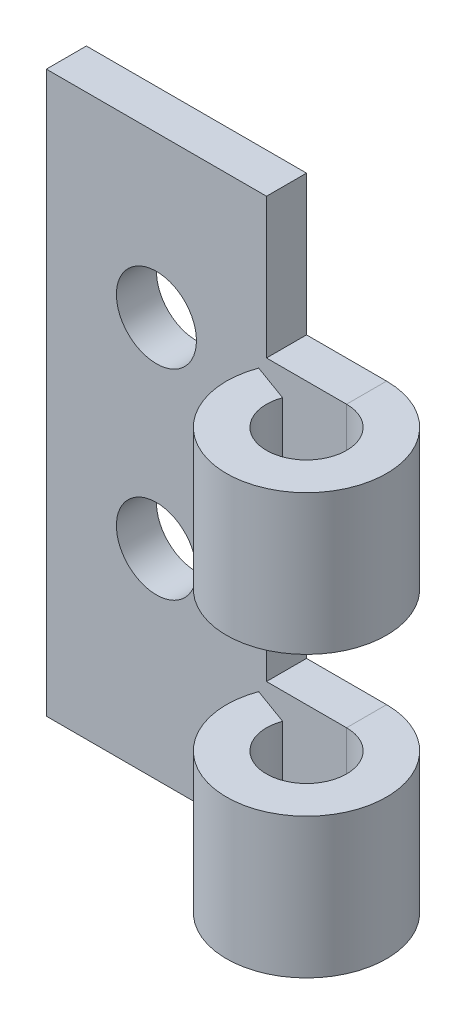
ISO-10303-21;
HEADER;
FILE_DESCRIPTION(('STEP AP214'),'2;1');
FILE_NAME('part.step','',(''),(''),'','','');
FILE_SCHEMA(('AUTOMOTIVE_DESIGN { 1 0 10303 214 1 1 1 1 }'));
ENDSEC;
DATA;
#1=APPLICATION_CONTEXT('core data for automotive mechanical design processes');
#2=APPLICATION_PROTOCOL_DEFINITION('international standard','automotive_design',2000,#1);
#3=PRODUCT_CONTEXT('',#1,'mechanical');
#4=PRODUCT('Part','Part','',(#3));
#5=PRODUCT_RELATED_PRODUCT_CATEGORY('part','',(#4));
#6=PRODUCT_DEFINITION_FORMATION('','',#4);
#7=PRODUCT_DEFINITION_CONTEXT('part definition',#1,'design');
#8=PRODUCT_DEFINITION('design','',#6,#7);
#9=PRODUCT_DEFINITION_SHAPE('','',#8);
#10=(LENGTH_UNIT() NAMED_UNIT(*) SI_UNIT(.MILLI.,.METRE.));
#11=(NAMED_UNIT(*) PLANE_ANGLE_UNIT() SI_UNIT($,.RADIAN.));
#12=(NAMED_UNIT(*) SI_UNIT($,.STERADIAN.) SOLID_ANGLE_UNIT());
#13=UNCERTAINTY_MEASURE_WITH_UNIT(LENGTH_MEASURE(1.E-05),#10,'distance_accuracy_value','');
#14=(GEOMETRIC_REPRESENTATION_CONTEXT(3) GLOBAL_UNCERTAINTY_ASSIGNED_CONTEXT((#13)) GLOBAL_UNIT_ASSIGNED_CONTEXT((#10,
#11,#12)) REPRESENTATION_CONTEXT('',''));
#15=CARTESIAN_POINT('',(0.,0.,0.));
#16=DIRECTION('',(0.,0.,1.));
#17=DIRECTION('',(1.,0.,0.));
#18=AXIS2_PLACEMENT_3D('',#15,#16,#17);
#19=CARTESIAN_POINT('',(-48.4821819299049,-11.4289291103172,1.));
#20=DIRECTION('',(1.,0.,0.));
#21=DIRECTION('',(0.,0.,-1.));
#22=AXIS2_PLACEMENT_3D('',#19,#20,#21);
#23=PLANE('',#22);
#24=DIRECTION('',(0.,-1.,0.));
#25=VECTOR('',#24,1.);
#26=CARTESIAN_POINT('',(-48.4821819299049,-11.4289291103172,0.));
#27=LINE('',#26,#25);
#28=CARTESIAN_POINT('',(-48.4821819299049,-11.4289291103172,0.));
#29=VERTEX_POINT('',#28);
#30=CARTESIAN_POINT('',(-48.4821819299049,-25.4289291103172,0.));
#31=VERTEX_POINT('',#30);
#32=EDGE_CURVE('E256',#29,#31,#27,.T.);
#33=ORIENTED_EDGE('',*,*,#32,.T.);
#34=DIRECTION('',(0.,0.,1.));
#35=VECTOR('',#34,1.);
#36=CARTESIAN_POINT('',(-48.4821819299049,-25.4289291103172,-0.00100000000000729));
#37=LINE('',#36,#35);
#38=CARTESIAN_POINT('',(-48.4821819299049,-25.4289291103172,1.));
#39=VERTEX_POINT('',#38);
#40=EDGE_CURVE('E190',#31,#39,#37,.T.);
#41=ORIENTED_EDGE('',*,*,#40,.T.);
#42=DIRECTION('',(0.,-1.,0.));
#43=VECTOR('',#42,1.);
#44=CARTESIAN_POINT('',(-48.4821819299049,-11.4289291103172,1.));
#45=LINE('',#44,#43);
#46=CARTESIAN_POINT('',(-48.4821819299049,-11.4289291103172,1.));
#47=VERTEX_POINT('',#46);
#48=EDGE_CURVE('E258',#47,#39,#45,.T.);
#49=ORIENTED_EDGE('',*,*,#48,.F.);
#50=DIRECTION('',(0.,0.,-1.));
#51=VECTOR('',#50,1.);
#52=CARTESIAN_POINT('',(-48.4821819299049,-11.4289291103172,1.));
#53=LINE('',#52,#51);
#54=EDGE_CURVE('E11',#47,#29,#53,.T.);
#55=ORIENTED_EDGE('',*,*,#54,.T.);
#56=EDGE_LOOP('',(#33,#41,#49,#55));
#57=FACE_BOUND('',#56,.T.);
#58=ADVANCED_FACE('F37',(#57),#23,.F.);
#59=CARTESIAN_POINT('',(-48.4821819299049,-11.4289291103172,1.));
#60=DIRECTION('',(0.,-1.,0.));
#61=DIRECTION('',(0.,0.,-1.));
#62=AXIS2_PLACEMENT_3D('',#59,#60,#61);
#63=PLANE('',#62);
#64=DIRECTION('',(-1.,0.,0.));
#65=VECTOR('',#64,1.);
#66=CARTESIAN_POINT('',(-48.4821819299049,-11.4289291103172,1.));
#67=LINE('',#66,#65);
#68=CARTESIAN_POINT('',(-42.9821819299048,-11.4289291103172,1.));
#69=VERTEX_POINT('',#68);
#70=EDGE_CURVE('E45',#69,#47,#67,.T.);
#71=ORIENTED_EDGE('',*,*,#70,.F.);
#72=DIRECTION('',(0.,0.,1.));
#73=VECTOR('',#72,1.);
#74=CARTESIAN_POINT('',(-42.9821819299048,-11.4289291103172,-0.00100000000000729));
#75=LINE('',#74,#73);
#76=CARTESIAN_POINT('',(-42.9821819299048,-11.4289291103172,0.));
#77=VERTEX_POINT('',#76);
#78=EDGE_CURVE('E142',#77,#69,#75,.T.);
#79=ORIENTED_EDGE('',*,*,#78,.F.);
#80=DIRECTION('',(-1.,0.,0.));
#81=VECTOR('',#80,1.);
#82=CARTESIAN_POINT('',(-48.4821819299049,-11.4289291103172,0.));
#83=LINE('',#82,#81);
#84=EDGE_CURVE('E158',#77,#29,#83,.T.);
#85=ORIENTED_EDGE('',*,*,#84,.T.);
#86=ORIENTED_EDGE('',*,*,#54,.F.);
#87=EDGE_LOOP('',(#71,#79,#85,#86));
#88=FACE_BOUND('',#87,.T.);
#89=ADVANCED_FACE('F263',(#88),#63,.F.);
#90=CARTESIAN_POINT('',(0.,0.,1.));
#91=DIRECTION('',(0.,0.,1.));
#92=DIRECTION('',(1.,0.,0.));
#93=AXIS2_PLACEMENT_3D('',#90,#91,#92);
#94=PLANE('',#93);
#95=CARTESIAN_POINT('',(-45.7321819299049,-15.4289291103172,1.));
#96=DIRECTION('',(0.,0.,1.));
#97=DIRECTION('',(1.,0.,0.));
#98=AXIS2_PLACEMENT_3D('',#95,#96,#97);
#99=CIRCLE('',#98,0.999999999999998);
#100=CARTESIAN_POINT('',(-44.7321819299048,-15.4289291103172,1.));
#101=VERTEX_POINT('',#100);
#102=EDGE_CURVE('E547',#101,#101,#99,.T.);
#103=ORIENTED_EDGE('',*,*,#102,.F.);
#104=EDGE_LOOP('',(#103));
#105=FACE_BOUND('',#104,.T.);
#106=CARTESIAN_POINT('',(-45.7321819299049,-20.4289291103172,1.));
#107=DIRECTION('',(0.,0.,1.));
#108=DIRECTION('',(1.,0.,0.));
#109=AXIS2_PLACEMENT_3D('',#106,#107,#108);
#110=CIRCLE('',#109,0.999999999999998);
#111=CARTESIAN_POINT('',(-44.7321819299048,-20.4289291103172,1.));
#112=VERTEX_POINT('',#111);
#113=EDGE_CURVE('E552',#112,#112,#110,.T.);
#114=ORIENTED_EDGE('',*,*,#113,.F.);
#115=EDGE_LOOP('',(#114));
#116=FACE_BOUND('',#115,.T.);
#117=DIRECTION('',(0.,-1.,0.));
#118=VECTOR('',#117,1.);
#119=CARTESIAN_POINT('',(-42.9821819299048,-14.9289291103172,1.));
#120=LINE('',#119,#118);
#121=CARTESIAN_POINT('',(-42.9821819299048,-14.9289291103172,1.));
#122=VERTEX_POINT('',#121);
#123=EDGE_CURVE('E139',#69,#122,#120,.T.);
#124=ORIENTED_EDGE('',*,*,#123,.F.);
#125=ORIENTED_EDGE('',*,*,#70,.T.);
#126=ORIENTED_EDGE('',*,*,#48,.T.);
#127=DIRECTION('',(-1.,0.,0.));
#128=VECTOR('',#127,1.);
#129=CARTESIAN_POINT('',(-40.9821819299049,-25.4289291103172,1.));
#130=LINE('',#129,#128);
#131=CARTESIAN_POINT('',(-40.9821819299049,-25.4289291103172,1.));
#132=VERTEX_POINT('',#131);
#133=EDGE_CURVE('E188',#132,#39,#130,.T.);
#134=ORIENTED_EDGE('',*,*,#133,.F.);
#135=DIRECTION('',(0.,1.,0.));
#136=VECTOR('',#135,1.);
#137=CARTESIAN_POINT('',(-40.9821819299049,-21.9289291103172,0.999999999999993));
#138=LINE('',#137,#136);
#139=CARTESIAN_POINT('',(-40.9821819299049,-21.9289291103172,0.999999999999993));
#140=VERTEX_POINT('',#139);
#141=EDGE_CURVE('E211',#140,#132,#138,.F.);
#142=ORIENTED_EDGE('',*,*,#141,.F.);
#143=DIRECTION('',(1.,0.,0.));
#144=VECTOR('',#143,1.);
#145=CARTESIAN_POINT('',(-42.9821819299049,-21.9289291103172,1.));
#146=LINE('',#145,#144);
#147=CARTESIAN_POINT('',(-42.9821819299049,-21.9289291103172,1.));
#148=VERTEX_POINT('',#147);
#149=EDGE_CURVE('E180',#148,#140,#146,.T.);
#150=ORIENTED_EDGE('',*,*,#149,.F.);
#151=DIRECTION('',(0.,-1.,0.));
#152=VECTOR('',#151,1.);
#153=CARTESIAN_POINT('',(-42.9821819299049,-21.9289291103172,1.));
#154=LINE('',#153,#152);
#155=CARTESIAN_POINT('',(-42.9821819299049,-18.4289291103172,1.));
#156=VERTEX_POINT('',#155);
#157=EDGE_CURVE('E177',#156,#148,#154,.T.);
#158=ORIENTED_EDGE('',*,*,#157,.F.);
#159=DIRECTION('',(-1.,0.,0.));
#160=VECTOR('',#159,1.);
#161=CARTESIAN_POINT('',(-42.9821819299049,-18.4289291103172,1.));
#162=LINE('',#161,#160);
#163=CARTESIAN_POINT('',(-40.9821819299049,-18.4289291103172,1.));
#164=VERTEX_POINT('',#163);
#165=EDGE_CURVE('E182',#164,#156,#162,.T.);
#166=ORIENTED_EDGE('',*,*,#165,.F.);
#167=DIRECTION('',(0.,1.,0.));
#168=VECTOR('',#167,1.);
#169=CARTESIAN_POINT('',(-40.9821819299049,-14.9289291103172,1.));
#170=LINE('',#169,#168);
#171=CARTESIAN_POINT('',(-40.9821819299049,-14.9289291103172,1.));
#172=VERTEX_POINT('',#171);
#173=EDGE_CURVE('E241',#172,#164,#170,.F.);
#174=ORIENTED_EDGE('',*,*,#173,.F.);
#175=DIRECTION('',(1.,0.,0.));
#176=VECTOR('',#175,1.);
#177=CARTESIAN_POINT('',(-42.9821819299048,-14.9289291103172,1.));
#178=LINE('',#177,#176);
#179=EDGE_CURVE('E143',#122,#172,#178,.T.);
#180=ORIENTED_EDGE('',*,*,#179,.F.);
#181=EDGE_LOOP('',(#124,#125,#126,#134,#142,#150,#158,#166,#174,#180));
#182=FACE_BOUND('',#181,.T.);
#183=ADVANCED_FACE('F288',(#105,#116,#182),#94,.T.);
#184=CARTESIAN_POINT('',(0.,0.,0.));
#185=DIRECTION('',(0.,0.,1.));
#186=DIRECTION('',(1.,0.,0.));
#187=AXIS2_PLACEMENT_3D('',#184,#185,#186);
#188=PLANE('',#187);
#189=CARTESIAN_POINT('',(-45.7321819299049,-15.4289291103172,0.));
#190=DIRECTION('',(0.,0.,1.));
#191=DIRECTION('',(1.,0.,0.));
#192=AXIS2_PLACEMENT_3D('',#189,#190,#191);
#193=CIRCLE('',#192,0.999999999999998);
#194=CARTESIAN_POINT('',(-44.7321819299048,-15.4289291103172,0.));
#195=VERTEX_POINT('',#194);
#196=EDGE_CURVE('E191',#195,#195,#193,.F.);
#197=ORIENTED_EDGE('',*,*,#196,.F.);
#198=EDGE_LOOP('',(#197));
#199=FACE_BOUND('',#198,.T.);
#200=CARTESIAN_POINT('',(-45.7321819299049,-20.4289291103172,0.));
#201=DIRECTION('',(0.,0.,1.));
#202=DIRECTION('',(1.,0.,0.));
#203=AXIS2_PLACEMENT_3D('',#200,#201,#202);
#204=CIRCLE('',#203,0.999999999999998);
#205=CARTESIAN_POINT('',(-44.7321819299048,-20.4289291103172,0.));
#206=VERTEX_POINT('',#205);
#207=EDGE_CURVE('E166',#206,#206,#204,.F.);
#208=ORIENTED_EDGE('',*,*,#207,.F.);
#209=EDGE_LOOP('',(#208));
#210=FACE_BOUND('',#209,.T.);
#211=ORIENTED_EDGE('',*,*,#84,.F.);
#212=DIRECTION('',(0.,1.,0.));
#213=VECTOR('',#212,1.);
#214=CARTESIAN_POINT('',(-42.9821819299048,-14.9289291103172,0.));
#215=LINE('',#214,#213);
#216=CARTESIAN_POINT('',(-42.9821819299048,-14.9289291103172,0.));
#217=VERTEX_POINT('',#216);
#218=EDGE_CURVE('E137',#217,#77,#215,.T.);
#219=ORIENTED_EDGE('',*,*,#218,.F.);
#220=DIRECTION('',(-1.,0.,0.));
#221=VECTOR('',#220,1.);
#222=CARTESIAN_POINT('',(-42.9821819299048,-14.9289291103172,0.));
#223=LINE('',#222,#221);
#224=CARTESIAN_POINT('',(-40.9821819299049,-14.9289291103172,0.));
#225=VERTEX_POINT('',#224);
#226=EDGE_CURVE('E146',#225,#217,#223,.T.);
#227=ORIENTED_EDGE('',*,*,#226,.F.);
#228=DIRECTION('',(0.,1.,0.));
#229=VECTOR('',#228,1.);
#230=CARTESIAN_POINT('',(-40.9821819299049,-14.9289291103172,0.));
#231=LINE('',#230,#229);
#232=CARTESIAN_POINT('',(-40.9821819299049,-18.4289291103172,0.));
#233=VERTEX_POINT('',#232);
#234=EDGE_CURVE('E228',#225,#233,#231,.F.);
#235=ORIENTED_EDGE('',*,*,#234,.T.);
#236=DIRECTION('',(1.,0.,0.));
#237=VECTOR('',#236,1.);
#238=CARTESIAN_POINT('',(-42.9821819299049,-18.4289291103172,0.));
#239=LINE('',#238,#237);
#240=CARTESIAN_POINT('',(-42.9821819299049,-18.4289291103172,0.));
#241=VERTEX_POINT('',#240);
#242=EDGE_CURVE('E174',#241,#233,#239,.T.);
#243=ORIENTED_EDGE('',*,*,#242,.F.);
#244=DIRECTION('',(0.,1.,0.));
#245=VECTOR('',#244,1.);
#246=CARTESIAN_POINT('',(-42.9821819299049,-21.9289291103172,0.));
#247=LINE('',#246,#245);
#248=CARTESIAN_POINT('',(-42.9821819299049,-21.9289291103172,0.));
#249=VERTEX_POINT('',#248);
#250=EDGE_CURVE('E171',#249,#241,#247,.T.);
#251=ORIENTED_EDGE('',*,*,#250,.F.);
#252=DIRECTION('',(-1.,0.,0.));
#253=VECTOR('',#252,1.);
#254=CARTESIAN_POINT('',(-42.9821819299049,-21.9289291103172,0.));
#255=LINE('',#254,#253);
#256=CARTESIAN_POINT('',(-40.9821819299049,-21.9289291103172,0.));
#257=VERTEX_POINT('',#256);
#258=EDGE_CURVE('E159',#257,#249,#255,.T.);
#259=ORIENTED_EDGE('',*,*,#258,.F.);
#260=DIRECTION('',(0.,1.,0.));
#261=VECTOR('',#260,1.);
#262=CARTESIAN_POINT('',(-40.9821819299049,-21.9289291103172,0.));
#263=LINE('',#262,#261);
#264=CARTESIAN_POINT('',(-40.9821819299049,-25.4289291103172,0.));
#265=VERTEX_POINT('',#264);
#266=EDGE_CURVE('E195',#257,#265,#263,.F.);
#267=ORIENTED_EDGE('',*,*,#266,.T.);
#268=DIRECTION('',(1.,0.,0.));
#269=VECTOR('',#268,1.);
#270=CARTESIAN_POINT('',(-40.9821819299049,-25.4289291103172,0.));
#271=LINE('',#270,#269);
#272=EDGE_CURVE('E175',#31,#265,#271,.T.);
#273=ORIENTED_EDGE('',*,*,#272,.F.);
#274=ORIENTED_EDGE('',*,*,#32,.F.);
#275=EDGE_LOOP('',(#211,#219,#227,#235,#243,#251,#259,#267,#273,#274));
#276=FACE_BOUND('',#275,.T.);
#277=ADVANCED_FACE('F156',(#199,#210,#276),#188,.F.);
#278=CARTESIAN_POINT('',(-41.9218745506908,-16.6789291103172,1.65797985667432));
#279=DIRECTION('',(-0.342020143325679,0.,0.939692620785905));
#280=DIRECTION('',(0.,1.,0.));
#281=AXIS2_PLACEMENT_3D('',#278,#279,#280);
#282=PLANE('',#281);
#283=DIRECTION('',(-0.939692620785905,0.,-0.342020143325679));
#284=VECTOR('',#283,1.);
#285=CARTESIAN_POINT('',(-41.9218745506908,-14.9289291103172,1.65797985667432));
#286=LINE('',#285,#284);
#287=CARTESIAN_POINT('',(-41.9218745506908,-14.9289291103172,1.65797985667432));
#288=VERTEX_POINT('',#287);
#289=CARTESIAN_POINT('',(-42.8615671714767,-14.9289291103172,1.31595971334864));
#290=VERTEX_POINT('',#289);
#291=EDGE_CURVE('E254',#288,#290,#286,.T.);
#292=ORIENTED_EDGE('',*,*,#291,.F.);
#293=DIRECTION('',(0.,1.,0.));
#294=VECTOR('',#293,1.);
#295=CARTESIAN_POINT('',(-41.9218745506908,-14.9289291103172,1.65797985667432));
#296=LINE('',#295,#294);
#297=CARTESIAN_POINT('',(-41.9218745506908,-18.4289291103172,1.65797985667432));
#298=VERTEX_POINT('',#297);
#299=EDGE_CURVE('E226',#298,#288,#296,.T.);
#300=ORIENTED_EDGE('',*,*,#299,.F.);
#301=DIRECTION('',(-0.939692620785905,0.,-0.342020143325679));
#302=VECTOR('',#301,1.);
#303=CARTESIAN_POINT('',(-41.9218745506908,-18.4289291103172,1.65797985667432));
#304=LINE('',#303,#302);
#305=CARTESIAN_POINT('',(-42.8615671714767,-18.4289291103172,1.31595971334864));
#306=VERTEX_POINT('',#305);
#307=EDGE_CURVE('E252',#298,#306,#304,.T.);
#308=ORIENTED_EDGE('',*,*,#307,.T.);
#309=DIRECTION('',(0.,1.,0.));
#310=VECTOR('',#309,1.);
#311=CARTESIAN_POINT('',(-42.8615671714767,-14.9289291103172,1.31595971334864));
#312=LINE('',#311,#310);
#313=EDGE_CURVE('E234',#306,#290,#312,.T.);
#314=ORIENTED_EDGE('',*,*,#313,.T.);
#315=EDGE_LOOP('',(#292,#300,#308,#314));
#316=FACE_BOUND('',#315,.T.);
#317=ADVANCED_FACE('F317',(#316),#282,.F.);
#318=CARTESIAN_POINT('',(-40.9821819299049,-18.4289291103172,2.));
#319=DIRECTION('',(0.,-1.,0.));
#320=DIRECTION('',(0.,0.,-1.));
#321=AXIS2_PLACEMENT_3D('',#318,#319,#320);
#322=PLANE('',#321);
#323=ORIENTED_EDGE('',*,*,#307,.F.);
#324=CARTESIAN_POINT('',(-40.9821819299049,-18.4289291103172,2.));
#325=DIRECTION('',(0.,1.,0.));
#326=DIRECTION('',(0.,0.,1.));
#327=AXIS2_PLACEMENT_3D('',#324,#325,#326);
#328=CIRCLE('',#327,0.999999999999996);
#329=EDGE_CURVE('E237',#164,#298,#328,.F.);
#330=ORIENTED_EDGE('',*,*,#329,.F.);
#331=DIRECTION('',(0.,0.,-1.));
#332=VECTOR('',#331,1.);
#333=CARTESIAN_POINT('',(-40.9821819299049,-18.4289291103172,1.));
#334=LINE('',#333,#332);
#335=EDGE_CURVE('E249',#164,#233,#334,.T.);
#336=ORIENTED_EDGE('',*,*,#335,.T.);
#337=CARTESIAN_POINT('',(-40.9821819299049,-18.4289291103172,2.));
#338=DIRECTION('',(0.,1.,0.));
#339=DIRECTION('',(0.,0.,1.));
#340=AXIS2_PLACEMENT_3D('',#337,#338,#339);
#341=CIRCLE('',#340,2.);
#342=EDGE_CURVE('E230',#233,#306,#341,.F.);
#343=ORIENTED_EDGE('',*,*,#342,.T.);
#344=EDGE_LOOP('',(#323,#330,#336,#343));
#345=FACE_BOUND('',#344,.T.);
#346=ADVANCED_FACE('F324',(#345),#322,.T.);
#347=CARTESIAN_POINT('',(-40.9821819299049,-14.9289291103172,2.));
#348=DIRECTION('',(0.,-1.,0.));
#349=DIRECTION('',(0.,0.,-1.));
#350=AXIS2_PLACEMENT_3D('',#347,#348,#349);
#351=PLANE('',#350);
#352=CARTESIAN_POINT('',(-40.9821819299049,-14.9289291103172,2.));
#353=DIRECTION('',(0.,1.,0.));
#354=DIRECTION('',(0.,0.,1.));
#355=AXIS2_PLACEMENT_3D('',#352,#353,#354);
#356=CIRCLE('',#355,0.999999999999996);
#357=EDGE_CURVE('E244',#288,#172,#356,.T.);
#358=ORIENTED_EDGE('',*,*,#357,.F.);
#359=ORIENTED_EDGE('',*,*,#291,.T.);
#360=CARTESIAN_POINT('',(-40.9821819299049,-14.9289291103172,2.));
#361=DIRECTION('',(0.,1.,0.));
#362=DIRECTION('',(0.,0.,1.));
#363=AXIS2_PLACEMENT_3D('',#360,#361,#362);
#364=CIRCLE('',#363,2.);
#365=EDGE_CURVE('E231',#290,#225,#364,.T.);
#366=ORIENTED_EDGE('',*,*,#365,.T.);
#367=DIRECTION('',(0.,0.,-1.));
#368=VECTOR('',#367,1.);
#369=CARTESIAN_POINT('',(-40.9821819299049,-14.9289291103172,1.));
#370=LINE('',#369,#368);
#371=EDGE_CURVE('E149',#172,#225,#370,.T.);
#372=ORIENTED_EDGE('',*,*,#371,.F.);
#373=EDGE_LOOP('',(#358,#359,#366,#372));
#374=FACE_BOUND('',#373,.T.);
#375=ADVANCED_FACE('F320',(#374),#351,.F.);
#376=CARTESIAN_POINT('',(-40.9821819299049,-14.9289291103172,2.));
#377=DIRECTION('',(0.,1.,0.));
#378=DIRECTION('',(-0.939692620785905,0.,-0.342020143325679));
#379=AXIS2_PLACEMENT_3D('',#376,#377,#378);
#380=CYLINDRICAL_SURFACE('',#379,2.);
#381=ORIENTED_EDGE('',*,*,#234,.F.);
#382=ORIENTED_EDGE('',*,*,#365,.F.);
#383=ORIENTED_EDGE('',*,*,#313,.F.);
#384=ORIENTED_EDGE('',*,*,#342,.F.);
#385=EDGE_LOOP('',(#381,#382,#383,#384));
#386=FACE_BOUND('',#385,.T.);
#387=ADVANCED_FACE('F323',(#386),#380,.T.);
#388=CARTESIAN_POINT('',(-40.9821819299049,-14.9289291103172,2.));
#389=DIRECTION('',(0.,1.,0.));
#390=DIRECTION('',(-0.939692620785905,0.,-0.342020143325679));
#391=AXIS2_PLACEMENT_3D('',#388,#389,#390);
#392=CYLINDRICAL_SURFACE('',#391,0.999999999999996);
#393=ORIENTED_EDGE('',*,*,#173,.T.);
#394=ORIENTED_EDGE('',*,*,#329,.T.);
#395=ORIENTED_EDGE('',*,*,#299,.T.);
#396=ORIENTED_EDGE('',*,*,#357,.T.);
#397=EDGE_LOOP('',(#393,#394,#395,#396));
#398=FACE_BOUND('',#397,.T.);
#399=ADVANCED_FACE('F332',(#398),#392,.F.);
#400=CARTESIAN_POINT('',(-41.9218745506908,-23.6789291103172,1.65797985667432));
#401=DIRECTION('',(-0.342020143325679,0.,0.939692620785905));
#402=DIRECTION('',(0.,1.,0.));
#403=AXIS2_PLACEMENT_3D('',#400,#401,#402);
#404=PLANE('',#403);
#405=DIRECTION('',(-0.939692620785905,0.,-0.342020143325679));
#406=VECTOR('',#405,1.);
#407=CARTESIAN_POINT('',(-41.9218745506908,-21.9289291103172,1.65797985667432));
#408=LINE('',#407,#406);
#409=CARTESIAN_POINT('',(-41.9218745506908,-21.9289291103172,1.65797985667432));
#410=VERTEX_POINT('',#409);
#411=CARTESIAN_POINT('',(-42.8615671714767,-21.9289291103172,1.31595971334864));
#412=VERTEX_POINT('',#411);
#413=EDGE_CURVE('E224',#410,#412,#408,.T.);
#414=ORIENTED_EDGE('',*,*,#413,.F.);
#415=DIRECTION('',(0.,1.,0.));
#416=VECTOR('',#415,1.);
#417=CARTESIAN_POINT('',(-41.9218745506908,-21.9289291103172,1.65797985667432));
#418=LINE('',#417,#416);
#419=CARTESIAN_POINT('',(-41.9218745506908,-25.4289291103172,1.65797985667432));
#420=VERTEX_POINT('',#419);
#421=EDGE_CURVE('E153',#420,#410,#418,.T.);
#422=ORIENTED_EDGE('',*,*,#421,.F.);
#423=DIRECTION('',(-0.939692620785905,0.,-0.342020143325679));
#424=VECTOR('',#423,1.);
#425=CARTESIAN_POINT('',(-41.9218745506908,-25.4289291103172,1.65797985667432));
#426=LINE('',#425,#424);
#427=CARTESIAN_POINT('',(-42.8615671714767,-25.4289291103172,1.31595971334864));
#428=VERTEX_POINT('',#427);
#429=EDGE_CURVE('E222',#420,#428,#426,.T.);
#430=ORIENTED_EDGE('',*,*,#429,.T.);
#431=DIRECTION('',(0.,1.,0.));
#432=VECTOR('',#431,1.);
#433=CARTESIAN_POINT('',(-42.8615671714767,-21.9289291103172,1.31595971334864));
#434=LINE('',#433,#432);
#435=EDGE_CURVE('E203',#428,#412,#434,.T.);
#436=ORIENTED_EDGE('',*,*,#435,.T.);
#437=EDGE_LOOP('',(#414,#422,#430,#436));
#438=FACE_BOUND('',#437,.T.);
#439=ADVANCED_FACE('F281',(#438),#404,.F.);
#440=CARTESIAN_POINT('',(-40.9821819299049,-25.4289291103172,2.));
#441=DIRECTION('',(0.,-1.,0.));
#442=DIRECTION('',(0.,0.,-1.));
#443=AXIS2_PLACEMENT_3D('',#440,#441,#442);
#444=PLANE('',#443);
#445=ORIENTED_EDGE('',*,*,#429,.F.);
#446=CARTESIAN_POINT('',(-40.9821819299049,-25.4289291103172,2.));
#447=DIRECTION('',(0.,1.,0.));
#448=DIRECTION('',(0.,0.,1.));
#449=AXIS2_PLACEMENT_3D('',#446,#447,#448);
#450=CIRCLE('',#449,1.);
#451=EDGE_CURVE('E206',#132,#420,#450,.F.);
#452=ORIENTED_EDGE('',*,*,#451,.F.);
#453=DIRECTION('',(0.,0.,-1.));
#454=VECTOR('',#453,1.);
#455=CARTESIAN_POINT('',(-40.9821819299049,-25.4289291103172,0.999999999999993));
#456=LINE('',#455,#454);
#457=EDGE_CURVE('E219',#132,#265,#456,.T.);
#458=ORIENTED_EDGE('',*,*,#457,.T.);
#459=CARTESIAN_POINT('',(-40.9821819299049,-25.4289291103172,2.));
#460=DIRECTION('',(0.,1.,0.));
#461=DIRECTION('',(0.,0.,1.));
#462=AXIS2_PLACEMENT_3D('',#459,#460,#461);
#463=CIRCLE('',#462,2.);
#464=EDGE_CURVE('E198',#265,#428,#463,.F.);
#465=ORIENTED_EDGE('',*,*,#464,.T.);
#466=EDGE_LOOP('',(#445,#452,#458,#465));
#467=FACE_BOUND('',#466,.T.);
#468=ADVANCED_FACE('F275',(#467),#444,.T.);
#469=CARTESIAN_POINT('',(-40.9821819299049,-21.9289291103172,2.));
#470=DIRECTION('',(0.,-1.,0.));
#471=DIRECTION('',(0.,0.,-1.));
#472=AXIS2_PLACEMENT_3D('',#469,#470,#471);
#473=PLANE('',#472);
#474=CARTESIAN_POINT('',(-40.9821819299049,-21.9289291103172,2.));
#475=DIRECTION('',(0.,1.,0.));
#476=DIRECTION('',(0.,0.,1.));
#477=AXIS2_PLACEMENT_3D('',#474,#475,#476);
#478=CIRCLE('',#477,1.);
#479=EDGE_CURVE('E214',#410,#140,#478,.T.);
#480=ORIENTED_EDGE('',*,*,#479,.F.);
#481=ORIENTED_EDGE('',*,*,#413,.T.);
#482=CARTESIAN_POINT('',(-40.9821819299049,-21.9289291103172,2.));
#483=DIRECTION('',(0.,1.,0.));
#484=DIRECTION('',(0.,0.,1.));
#485=AXIS2_PLACEMENT_3D('',#482,#483,#484);
#486=CIRCLE('',#485,2.);
#487=EDGE_CURVE('E199',#412,#257,#486,.T.);
#488=ORIENTED_EDGE('',*,*,#487,.T.);
#489=DIRECTION('',(0.,0.,-1.));
#490=VECTOR('',#489,1.);
#491=CARTESIAN_POINT('',(-40.9821819299049,-21.9289291103172,0.999999999999993));
#492=LINE('',#491,#490);
#493=EDGE_CURVE('E202',#140,#257,#492,.T.);
#494=ORIENTED_EDGE('',*,*,#493,.F.);
#495=EDGE_LOOP('',(#480,#481,#488,#494));
#496=FACE_BOUND('',#495,.T.);
#497=ADVANCED_FACE('F295',(#496),#473,.F.);
#498=CARTESIAN_POINT('',(-40.9821819299049,-21.9289291103172,2.));
#499=DIRECTION('',(0.,1.,0.));
#500=DIRECTION('',(-0.939692620785905,0.,-0.342020143325679));
#501=AXIS2_PLACEMENT_3D('',#498,#499,#500);
#502=CYLINDRICAL_SURFACE('',#501,2.);
#503=ORIENTED_EDGE('',*,*,#266,.F.);
#504=ORIENTED_EDGE('',*,*,#487,.F.);
#505=ORIENTED_EDGE('',*,*,#435,.F.);
#506=ORIENTED_EDGE('',*,*,#464,.F.);
#507=EDGE_LOOP('',(#503,#504,#505,#506));
#508=FACE_BOUND('',#507,.T.);
#509=ADVANCED_FACE('F278',(#508),#502,.T.);
#510=CARTESIAN_POINT('',(-40.9821819299049,-21.9289291103172,2.));
#511=DIRECTION('',(0.,1.,0.));
#512=DIRECTION('',(-0.939692620785905,0.,-0.342020143325679));
#513=AXIS2_PLACEMENT_3D('',#510,#511,#512);
#514=CYLINDRICAL_SURFACE('',#513,1.);
#515=ORIENTED_EDGE('',*,*,#141,.T.);
#516=ORIENTED_EDGE('',*,*,#451,.T.);
#517=ORIENTED_EDGE('',*,*,#421,.T.);
#518=ORIENTED_EDGE('',*,*,#479,.T.);
#519=EDGE_LOOP('',(#515,#516,#517,#518));
#520=FACE_BOUND('',#519,.T.);
#521=ADVANCED_FACE('F285',(#520),#514,.F.);
#522=CARTESIAN_POINT('',(-42.9821819299049,-21.9289291103172,-0.00100000000000729));
#523=DIRECTION('',(-1.,0.,0.));
#524=DIRECTION('',(0.,0.,1.));
#525=AXIS2_PLACEMENT_3D('',#522,#523,#524);
#526=PLANE('',#525);
#527=ORIENTED_EDGE('',*,*,#250,.T.);
#528=DIRECTION('',(0.,0.,1.));
#529=VECTOR('',#528,1.);
#530=CARTESIAN_POINT('',(-42.9821819299049,-18.4289291103172,-0.00100000000000729));
#531=LINE('',#530,#529);
#532=EDGE_CURVE('E163',#241,#156,#531,.T.);
#533=ORIENTED_EDGE('',*,*,#532,.T.);
#534=ORIENTED_EDGE('',*,*,#157,.T.);
#535=DIRECTION('',(0.,0.,1.));
#536=VECTOR('',#535,1.);
#537=CARTESIAN_POINT('',(-42.9821819299049,-21.9289291103172,-0.00100000000000729));
#538=LINE('',#537,#536);
#539=EDGE_CURVE('E185',#249,#148,#538,.T.);
#540=ORIENTED_EDGE('',*,*,#539,.F.);
#541=EDGE_LOOP('',(#527,#533,#534,#540));
#542=FACE_BOUND('',#541,.T.);
#543=ADVANCED_FACE('F352',(#542),#526,.F.);
#544=CARTESIAN_POINT('',(-42.9821819299049,-18.4289291103172,-0.00100000000000729));
#545=DIRECTION('',(0.,1.,0.));
#546=DIRECTION('',(0.,0.,1.));
#547=AXIS2_PLACEMENT_3D('',#544,#545,#546);
#548=PLANE('',#547);
#549=ORIENTED_EDGE('',*,*,#242,.T.);
#550=ORIENTED_EDGE('',*,*,#335,.F.);
#551=ORIENTED_EDGE('',*,*,#165,.T.);
#552=ORIENTED_EDGE('',*,*,#532,.F.);
#553=EDGE_LOOP('',(#549,#550,#551,#552));
#554=FACE_BOUND('',#553,.T.);
#555=ADVANCED_FACE('F346',(#554),#548,.F.);
#556=CARTESIAN_POINT('',(-42.9821819299049,-21.9289291103172,-0.00100000000000729));
#557=DIRECTION('',(0.,-1.,0.));
#558=DIRECTION('',(0.,0.,-1.));
#559=AXIS2_PLACEMENT_3D('',#556,#557,#558);
#560=PLANE('',#559);
#561=ORIENTED_EDGE('',*,*,#258,.T.);
#562=ORIENTED_EDGE('',*,*,#539,.T.);
#563=ORIENTED_EDGE('',*,*,#149,.T.);
#564=ORIENTED_EDGE('',*,*,#493,.T.);
#565=EDGE_LOOP('',(#561,#562,#563,#564));
#566=FACE_BOUND('',#565,.T.);
#567=ADVANCED_FACE('F293',(#566),#560,.F.);
#568=CARTESIAN_POINT('',(-40.9821819299049,-25.4289291103172,-0.00100000000000729));
#569=DIRECTION('',(0.,1.,0.));
#570=DIRECTION('',(0.,0.,1.));
#571=AXIS2_PLACEMENT_3D('',#568,#569,#570);
#572=PLANE('',#571);
#573=ORIENTED_EDGE('',*,*,#272,.T.);
#574=ORIENTED_EDGE('',*,*,#457,.F.);
#575=ORIENTED_EDGE('',*,*,#133,.T.);
#576=ORIENTED_EDGE('',*,*,#40,.F.);
#577=EDGE_LOOP('',(#573,#574,#575,#576));
#578=FACE_BOUND('',#577,.T.);
#579=ADVANCED_FACE('F270',(#578),#572,.F.);
#580=CARTESIAN_POINT('',(-42.9821819299048,-14.9289291103172,-0.00100000000000729));
#581=DIRECTION('',(-1.,0.,0.));
#582=DIRECTION('',(0.,0.,1.));
#583=AXIS2_PLACEMENT_3D('',#580,#581,#582);
#584=PLANE('',#583);
#585=ORIENTED_EDGE('',*,*,#218,.T.);
#586=ORIENTED_EDGE('',*,*,#78,.T.);
#587=ORIENTED_EDGE('',*,*,#123,.T.);
#588=DIRECTION('',(0.,0.,1.));
#589=VECTOR('',#588,1.);
#590=CARTESIAN_POINT('',(-42.9821819299048,-14.9289291103172,-0.00100000000000729));
#591=LINE('',#590,#589);
#592=EDGE_CURVE('E133',#217,#122,#591,.T.);
#593=ORIENTED_EDGE('',*,*,#592,.F.);
#594=EDGE_LOOP('',(#585,#586,#587,#593));
#595=FACE_BOUND('',#594,.T.);
#596=ADVANCED_FACE('F135',(#595),#584,.F.);
#597=CARTESIAN_POINT('',(-42.9821819299048,-14.9289291103172,-0.00100000000000729));
#598=DIRECTION('',(0.,-1.,0.));
#599=DIRECTION('',(0.,0.,-1.));
#600=AXIS2_PLACEMENT_3D('',#597,#598,#599);
#601=PLANE('',#600);
#602=ORIENTED_EDGE('',*,*,#226,.T.);
#603=ORIENTED_EDGE('',*,*,#592,.T.);
#604=ORIENTED_EDGE('',*,*,#179,.T.);
#605=ORIENTED_EDGE('',*,*,#371,.T.);
#606=EDGE_LOOP('',(#602,#603,#604,#605));
#607=FACE_BOUND('',#606,.T.);
#608=ADVANCED_FACE('F147',(#607),#601,.F.);
#609=CARTESIAN_POINT('',(-45.7321819299049,-20.4289291103172,-0.00100000000000729));
#610=DIRECTION('',(0.,0.,1.));
#611=DIRECTION('',(1.,0.,0.));
#612=AXIS2_PLACEMENT_3D('',#609,#610,#611);
#613=CYLINDRICAL_SURFACE('',#612,0.999999999999998);
#614=ORIENTED_EDGE('',*,*,#113,.T.);
#615=EDGE_LOOP('',(#614));
#616=FACE_BOUND('',#615,.T.);
#617=ORIENTED_EDGE('',*,*,#207,.T.);
#618=EDGE_LOOP('',(#617));
#619=FACE_BOUND('',#618,.T.);
#620=ADVANCED_FACE('F441',(#616,#619),#613,.F.);
#621=CARTESIAN_POINT('',(-45.7321819299049,-15.4289291103172,-0.00100000000000729));
#622=DIRECTION('',(0.,0.,1.));
#623=DIRECTION('',(1.,0.,0.));
#624=AXIS2_PLACEMENT_3D('',#621,#622,#623);
#625=CYLINDRICAL_SURFACE('',#624,0.999999999999998);
#626=ORIENTED_EDGE('',*,*,#102,.T.);
#627=EDGE_LOOP('',(#626));
#628=FACE_BOUND('',#627,.T.);
#629=ORIENTED_EDGE('',*,*,#196,.T.);
#630=EDGE_LOOP('',(#629));
#631=FACE_BOUND('',#630,.T.);
#632=ADVANCED_FACE('F467',(#628,#631),#625,.F.);
#633=CLOSED_SHELL('',(#58,#89,#183,#277,#317,#346,#375,#387,#399,#439,#468,#497,#509,#521,#543,
#555,#567,#579,#596,#608,#620,#632));
#634=MANIFOLD_SOLID_BREP('B2',#633);
#635=ADVANCED_BREP_SHAPE_REPRESENTATION('',(#18,#634),#14);
#636=SHAPE_DEFINITION_REPRESENTATION(#9,#635);
ENDSEC;
END-ISO-10303-21;
